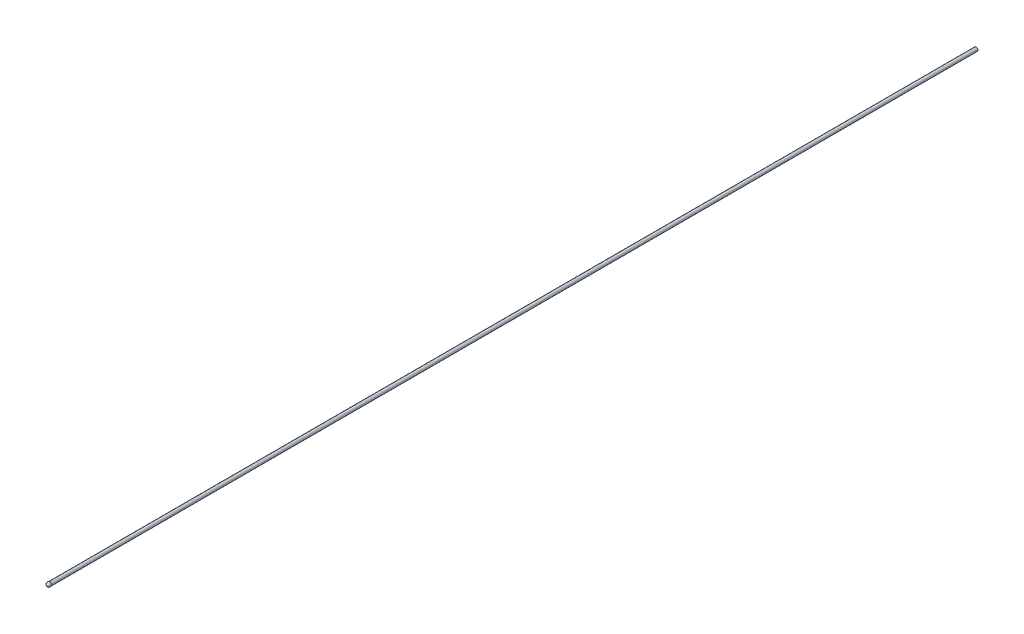
ISO-10303-21;
HEADER;
FILE_DESCRIPTION(('STEP AP214'),'2;1');
FILE_NAME('part.step','',(''),(''),'','','');
FILE_SCHEMA(('AUTOMOTIVE_DESIGN { 1 0 10303 214 1 1 1 1 }'));
ENDSEC;
DATA;
#1=APPLICATION_CONTEXT('core data for automotive mechanical design processes');
#2=APPLICATION_PROTOCOL_DEFINITION('international standard','automotive_design',2000,#1);
#3=PRODUCT_CONTEXT('',#1,'mechanical');
#4=PRODUCT('Part','Part','',(#3));
#5=PRODUCT_RELATED_PRODUCT_CATEGORY('part','',(#4));
#6=PRODUCT_DEFINITION_FORMATION('','',#4);
#7=PRODUCT_DEFINITION_CONTEXT('part definition',#1,'design');
#8=PRODUCT_DEFINITION('design','',#6,#7);
#9=PRODUCT_DEFINITION_SHAPE('','',#8);
#10=(LENGTH_UNIT() NAMED_UNIT(*) SI_UNIT(.MILLI.,.METRE.));
#11=(NAMED_UNIT(*) PLANE_ANGLE_UNIT() SI_UNIT($,.RADIAN.));
#12=(NAMED_UNIT(*) SI_UNIT($,.STERADIAN.) SOLID_ANGLE_UNIT());
#13=UNCERTAINTY_MEASURE_WITH_UNIT(LENGTH_MEASURE(1.E-05),#10,'distance_accuracy_value','');
#14=(GEOMETRIC_REPRESENTATION_CONTEXT(3) GLOBAL_UNCERTAINTY_ASSIGNED_CONTEXT((#13)) GLOBAL_UNIT_ASSIGNED_CONTEXT((#10,
#11,#12)) REPRESENTATION_CONTEXT('',''));
#15=CARTESIAN_POINT('',(0.,0.,0.));
#16=DIRECTION('',(0.,0.,1.));
#17=DIRECTION('',(1.,0.,0.));
#18=AXIS2_PLACEMENT_3D('',#15,#16,#17);
#19=CARTESIAN_POINT('',(-1.25,11.75,-625.));
#20=DIRECTION('',(0.,0.,1.));
#21=DIRECTION('',(1.,0.,0.));
#22=AXIS2_PLACEMENT_3D('',#19,#20,#21);
#23=PLANE('',#22);
#24=CARTESIAN_POINT('',(-1.25,11.75,-625.));
#25=DIRECTION('',(0.,0.,1.));
#26=DIRECTION('',(1.,0.,0.));
#27=AXIS2_PLACEMENT_3D('',#24,#25,#26);
#28=CIRCLE('',#27,1.25);
#29=CARTESIAN_POINT('',(0.,11.75,-625.));
#30=VERTEX_POINT('',#29);
#31=EDGE_CURVE('E10',#30,#30,#28,.T.);
#32=ORIENTED_EDGE('',*,*,#31,.F.);
#33=EDGE_LOOP('',(#32));
#34=FACE_BOUND('',#33,.T.);
#35=ADVANCED_FACE('F35',(#34),#23,.F.);
#36=CARTESIAN_POINT('',(-1.25,11.75,0.609374999999999));
#37=DIRECTION('',(0.,0.,1.));
#38=DIRECTION('',(1.,0.,0.));
#39=AXIS2_PLACEMENT_3D('',#36,#37,#38);
#40=SPHERICAL_SURFACE('',#39,1.390625);
#41=CARTESIAN_POINT('',(-1.25,11.75,0.));
#42=DIRECTION('',(0.,0.,1.));
#43=DIRECTION('',(1.,0.,0.));
#44=AXIS2_PLACEMENT_3D('',#41,#42,#43);
#45=CIRCLE('',#44,1.25);
#46=CARTESIAN_POINT('',(0.,11.75,0.));
#47=VERTEX_POINT('',#46);
#48=EDGE_CURVE('E39',#47,#47,#45,.T.);
#49=ORIENTED_EDGE('',*,*,#48,.T.);
#50=EDGE_LOOP('',(#49));
#51=FACE_BOUND('',#50,.T.);
#52=ADVANCED_FACE('F37',(#51),#40,.T.);
#53=CARTESIAN_POINT('',(-1.25,11.75,-628.535533905933));
#54=DIRECTION('',(0.,0.,1.));
#55=DIRECTION('',(1.,0.,0.));
#56=AXIS2_PLACEMENT_3D('',#53,#54,#55);
#57=CYLINDRICAL_SURFACE('',#56,1.25);
#58=ORIENTED_EDGE('',*,*,#48,.F.);
#59=EDGE_LOOP('',(#58));
#60=FACE_BOUND('',#59,.T.);
#61=ORIENTED_EDGE('',*,*,#31,.T.);
#62=EDGE_LOOP('',(#61));
#63=FACE_BOUND('',#62,.T.);
#64=ADVANCED_FACE('F49',(#60,#63),#57,.T.);
#65=CLOSED_SHELL('',(#35,#52,#64));
#66=MANIFOLD_SOLID_BREP('B2',#65);
#67=ADVANCED_BREP_SHAPE_REPRESENTATION('',(#18,#66),#14);
#68=SHAPE_DEFINITION_REPRESENTATION(#9,#67);
ENDSEC;
END-ISO-10303-21;
